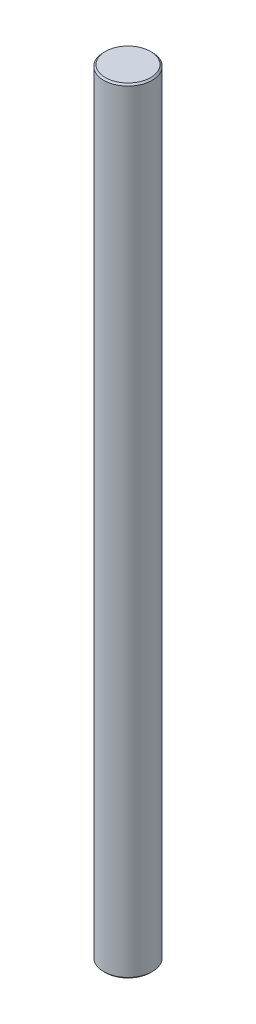
ISO-10303-21;
HEADER;
FILE_DESCRIPTION(('STEP AP214'),'2;1');
FILE_NAME('part.step','',(''),(''),'','','');
FILE_SCHEMA(('AUTOMOTIVE_DESIGN { 1 0 10303 214 1 1 1 1 }'));
ENDSEC;
DATA;
#1=APPLICATION_CONTEXT('core data for automotive mechanical design processes');
#2=APPLICATION_PROTOCOL_DEFINITION('international standard','automotive_design',2000,#1);
#3=PRODUCT_CONTEXT('',#1,'mechanical');
#4=PRODUCT('Part','Part','',(#3));
#5=PRODUCT_RELATED_PRODUCT_CATEGORY('part','',(#4));
#6=PRODUCT_DEFINITION_FORMATION('','',#4);
#7=PRODUCT_DEFINITION_CONTEXT('part definition',#1,'design');
#8=PRODUCT_DEFINITION('design','',#6,#7);
#9=PRODUCT_DEFINITION_SHAPE('','',#8);
#10=(LENGTH_UNIT() NAMED_UNIT(*) SI_UNIT(.MILLI.,.METRE.));
#11=(NAMED_UNIT(*) PLANE_ANGLE_UNIT() SI_UNIT($,.RADIAN.));
#12=(NAMED_UNIT(*) SI_UNIT($,.STERADIAN.) SOLID_ANGLE_UNIT());
#13=UNCERTAINTY_MEASURE_WITH_UNIT(LENGTH_MEASURE(1.E-05),#10,'distance_accuracy_value','');
#14=(GEOMETRIC_REPRESENTATION_CONTEXT(3) GLOBAL_UNCERTAINTY_ASSIGNED_CONTEXT((#13)) GLOBAL_UNIT_ASSIGNED_CONTEXT((#10,
#11,#12)) REPRESENTATION_CONTEXT('',''));
#15=CARTESIAN_POINT('',(0.,0.,0.));
#16=DIRECTION('',(0.,0.,1.));
#17=DIRECTION('',(1.,0.,0.));
#18=AXIS2_PLACEMENT_3D('',#15,#16,#17);
#19=CARTESIAN_POINT('',(0.,63.5,0.));
#20=DIRECTION('',(0.,-1.,0.));
#21=DIRECTION('',(0.,0.,-1.));
#22=AXIS2_PLACEMENT_3D('',#19,#20,#21);
#23=CYLINDRICAL_SURFACE('',#22,3.96875);
#24=CARTESIAN_POINT('',(0.,-63.246,0.));
#25=DIRECTION('',(0.,1.,0.));
#26=DIRECTION('',(0.,0.,1.));
#27=AXIS2_PLACEMENT_3D('',#24,#25,#26);
#28=CIRCLE('',#27,3.96875);
#29=CARTESIAN_POINT('',(0.,-63.246,3.96875));
#30=VERTEX_POINT('',#29);
#31=EDGE_CURVE('E42',#30,#30,#28,.T.);
#32=ORIENTED_EDGE('',*,*,#31,.T.);
#33=EDGE_LOOP('',(#32));
#34=FACE_BOUND('',#33,.T.);
#35=CARTESIAN_POINT('',(0.,63.246,0.));
#36=DIRECTION('',(0.,1.,0.));
#37=DIRECTION('',(0.,0.,1.));
#38=AXIS2_PLACEMENT_3D('',#35,#36,#37);
#39=CIRCLE('',#38,3.96875);
#40=CARTESIAN_POINT('',(0.,63.246,3.96875));
#41=VERTEX_POINT('',#40);
#42=EDGE_CURVE('E46',#41,#41,#39,.F.);
#43=ORIENTED_EDGE('',*,*,#42,.T.);
#44=EDGE_LOOP('',(#43));
#45=FACE_BOUND('',#44,.T.);
#46=ADVANCED_FACE('F31',(#34,#45),#23,.T.);
#47=CARTESIAN_POINT('',(0.,63.5,0.));
#48=DIRECTION('',(0.,1.,0.));
#49=DIRECTION('',(0.,0.,1.));
#50=AXIS2_PLACEMENT_3D('',#47,#48,#49);
#51=PLANE('',#50);
#52=CARTESIAN_POINT('',(0.,63.5,0.));
#53=DIRECTION('',(0.,1.,0.));
#54=DIRECTION('',(0.,0.,1.));
#55=AXIS2_PLACEMENT_3D('',#52,#53,#54);
#56=CIRCLE('',#55,3.71475);
#57=CARTESIAN_POINT('',(0.,63.5,3.71475));
#58=VERTEX_POINT('',#57);
#59=EDGE_CURVE('E10',#58,#58,#56,.T.);
#60=ORIENTED_EDGE('',*,*,#59,.T.);
#61=EDGE_LOOP('',(#60));
#62=FACE_BOUND('',#61,.T.);
#63=ADVANCED_FACE('F62',(#62),#51,.T.);
#64=CARTESIAN_POINT('',(0.,-63.5,0.));
#65=DIRECTION('',(0.,1.,0.));
#66=DIRECTION('',(0.,0.,1.));
#67=AXIS2_PLACEMENT_3D('',#64,#65,#66);
#68=PLANE('',#67);
#69=CARTESIAN_POINT('',(0.,-63.5,0.));
#70=DIRECTION('',(0.,1.,0.));
#71=DIRECTION('',(0.,0.,1.));
#72=AXIS2_PLACEMENT_3D('',#69,#70,#71);
#73=CIRCLE('',#72,3.71474999999996);
#74=CARTESIAN_POINT('',(0.,-63.5,3.71474999999996));
#75=VERTEX_POINT('',#74);
#76=EDGE_CURVE('E38',#75,#75,#73,.F.);
#77=ORIENTED_EDGE('',*,*,#76,.T.);
#78=EDGE_LOOP('',(#77));
#79=FACE_BOUND('',#78,.T.);
#80=ADVANCED_FACE('F59',(#79),#68,.F.);
#81=CARTESIAN_POINT('',(0.,-63.246,0.));
#82=DIRECTION('',(0.,1.,0.));
#83=DIRECTION('',(0.,0.,1.));
#84=AXIS2_PLACEMENT_3D('',#81,#82,#83);
#85=CONICAL_SURFACE('',#84,3.96875,0.785398163397464);
#86=ORIENTED_EDGE('',*,*,#76,.F.);
#87=EDGE_LOOP('',(#86));
#88=FACE_BOUND('',#87,.T.);
#89=ORIENTED_EDGE('',*,*,#31,.F.);
#90=EDGE_LOOP('',(#89));
#91=FACE_BOUND('',#90,.T.);
#92=ADVANCED_FACE('F55',(#88,#91),#85,.T.);
#93=CARTESIAN_POINT('',(0.,63.5,0.));
#94=DIRECTION('',(0.,-1.,0.));
#95=DIRECTION('',(0.,0.,-1.));
#96=AXIS2_PLACEMENT_3D('',#93,#94,#95);
#97=CONICAL_SURFACE('',#96,3.71475,0.785398163397409);
#98=ORIENTED_EDGE('',*,*,#42,.F.);
#99=EDGE_LOOP('',(#98));
#100=FACE_BOUND('',#99,.T.);
#101=ORIENTED_EDGE('',*,*,#59,.F.);
#102=EDGE_LOOP('',(#101));
#103=FACE_BOUND('',#102,.T.);
#104=ADVANCED_FACE('F33',(#100,#103),#97,.T.);
#105=CLOSED_SHELL('',(#46,#63,#80,#92,#104));
#106=MANIFOLD_SOLID_BREP('B2',#105);
#107=ADVANCED_BREP_SHAPE_REPRESENTATION('',(#18,#106),#14);
#108=SHAPE_DEFINITION_REPRESENTATION(#9,#107);
ENDSEC;
END-ISO-10303-21;
